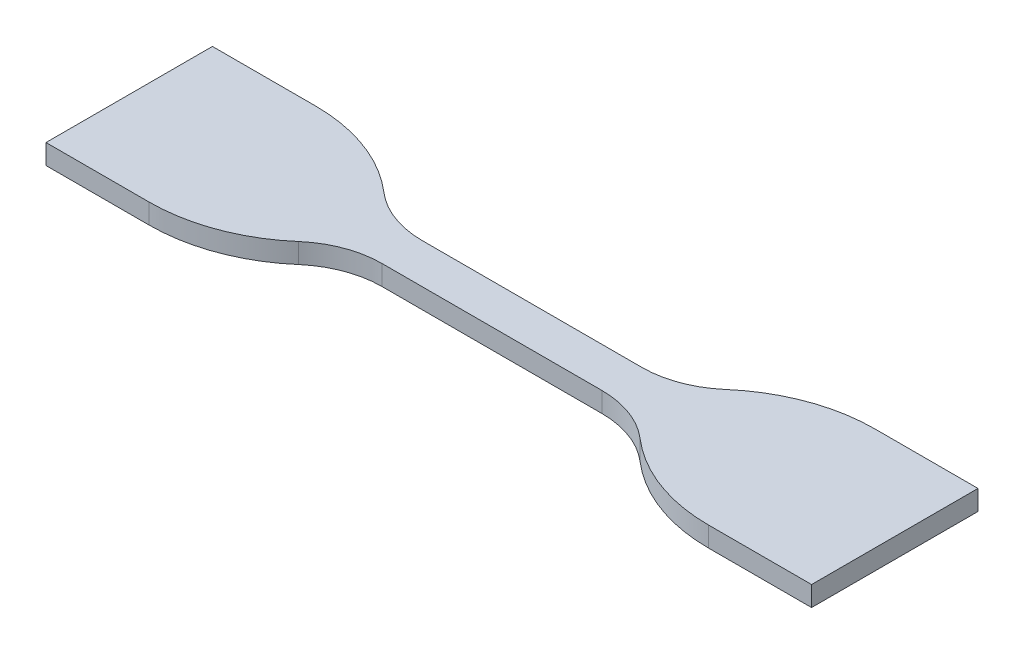
ISO-10303-21;
HEADER;
FILE_DESCRIPTION(('STEP AP214'),'2;1');
FILE_NAME('part.step','',(''),(''),'','','');
FILE_SCHEMA(('AUTOMOTIVE_DESIGN { 1 0 10303 214 1 1 1 1 }'));
ENDSEC;
DATA;
#1=APPLICATION_CONTEXT('core data for automotive mechanical design processes');
#2=APPLICATION_PROTOCOL_DEFINITION('international standard','automotive_design',2000,#1);
#3=PRODUCT_CONTEXT('',#1,'mechanical');
#4=PRODUCT('Part','Part','',(#3));
#5=PRODUCT_RELATED_PRODUCT_CATEGORY('part','',(#4));
#6=PRODUCT_DEFINITION_FORMATION('','',#4);
#7=PRODUCT_DEFINITION_CONTEXT('part definition',#1,'design');
#8=PRODUCT_DEFINITION('design','',#6,#7);
#9=PRODUCT_DEFINITION_SHAPE('','',#8);
#10=(LENGTH_UNIT() NAMED_UNIT(*) SI_UNIT(.MILLI.,.METRE.));
#11=(NAMED_UNIT(*) PLANE_ANGLE_UNIT() SI_UNIT($,.RADIAN.));
#12=(NAMED_UNIT(*) SI_UNIT($,.STERADIAN.) SOLID_ANGLE_UNIT());
#13=UNCERTAINTY_MEASURE_WITH_UNIT(LENGTH_MEASURE(1.E-05),#10,'distance_accuracy_value','');
#14=(GEOMETRIC_REPRESENTATION_CONTEXT(3) GLOBAL_UNCERTAINTY_ASSIGNED_CONTEXT((#13)) GLOBAL_UNIT_ASSIGNED_CONTEXT((#10,
#11,#12)) REPRESENTATION_CONTEXT('',''));
#15=CARTESIAN_POINT('',(0.,0.,0.));
#16=DIRECTION('',(0.,0.,1.));
#17=DIRECTION('',(1.,0.,0.));
#18=AXIS2_PLACEMENT_3D('',#15,#16,#17);
#19=CARTESIAN_POINT('',(25.5098020376482,3.,4.50000000000001));
#20=DIRECTION('',(0.,-1.,0.));
#21=DIRECTION('',(0.,0.,-1.));
#22=AXIS2_PLACEMENT_3D('',#19,#20,#21);
#23=CYLINDRICAL_SURFACE('',#22,14.);
#24=CARTESIAN_POINT('',(25.5098020376482,0.,4.50000000000001));
#25=DIRECTION('',(0.,-1.,0.));
#26=DIRECTION('',(0.,0.,-1.));
#27=AXIS2_PLACEMENT_3D('',#24,#25,#26);
#28=CIRCLE('',#27,14.);
#29=CARTESIAN_POINT('',(16.3524372036206,0.,-6.08974358974359));
#30=VERTEX_POINT('',#29);
#31=CARTESIAN_POINT('',(25.5098020376482,0.,-9.49999999999999));
#32=VERTEX_POINT('',#31);
#33=EDGE_CURVE('E179',#30,#32,#28,.T.);
#34=ORIENTED_EDGE('',*,*,#33,.T.);
#35=DIRECTION('',(0.,-1.,0.));
#36=VECTOR('',#35,1.);
#37=CARTESIAN_POINT('',(25.5098020376482,3.,-9.49999999999999));
#38=LINE('',#37,#36);
#39=CARTESIAN_POINT('',(25.5098020376482,3.,-9.49999999999999));
#40=VERTEX_POINT('',#39);
#41=EDGE_CURVE('E11',#40,#32,#38,.T.);
#42=ORIENTED_EDGE('',*,*,#41,.F.);
#43=CARTESIAN_POINT('',(25.5098020376482,3.,4.50000000000001));
#44=DIRECTION('',(0.,-1.,0.));
#45=DIRECTION('',(0.,0.,-1.));
#46=AXIS2_PLACEMENT_3D('',#43,#44,#45);
#47=CIRCLE('',#46,14.);
#48=CARTESIAN_POINT('',(16.3524372036206,3.,-6.08974358974359));
#49=VERTEX_POINT('',#48);
#50=EDGE_CURVE('E218',#49,#40,#47,.T.);
#51=ORIENTED_EDGE('',*,*,#50,.F.);
#52=DIRECTION('',(0.,-1.,0.));
#53=VECTOR('',#52,1.);
#54=CARTESIAN_POINT('',(16.3524372036206,3.,-6.08974358974359));
#55=LINE('',#54,#53);
#56=EDGE_CURVE('E175',#49,#30,#55,.T.);
#57=ORIENTED_EDGE('',*,*,#56,.T.);
#58=EDGE_LOOP('',(#34,#42,#51,#57));
#59=FACE_BOUND('',#58,.T.);
#60=ADVANCED_FACE('F36',(#59),#23,.F.);
#61=CARTESIAN_POINT('',(25.5098020376482,3.,-9.49999999999999));
#62=DIRECTION('',(0.,0.,-1.));
#63=DIRECTION('',(-1.,0.,0.));
#64=AXIS2_PLACEMENT_3D('',#61,#62,#63);
#65=PLANE('',#64);
#66=DIRECTION('',(1.,0.,0.));
#67=VECTOR('',#66,1.);
#68=CARTESIAN_POINT('',(25.5098020376482,0.,-9.49999999999999));
#69=LINE('',#68,#67);
#70=CARTESIAN_POINT('',(58.5098020376482,0.,-9.49999999999999));
#71=VERTEX_POINT('',#70);
#72=EDGE_CURVE('E182',#32,#71,#69,.T.);
#73=ORIENTED_EDGE('',*,*,#72,.T.);
#74=DIRECTION('',(0.,-1.,0.));
#75=VECTOR('',#74,1.);
#76=CARTESIAN_POINT('',(58.5098020376482,3.,-9.49999999999999));
#77=LINE('',#76,#75);
#78=CARTESIAN_POINT('',(58.5098020376482,3.,-9.49999999999999));
#79=VERTEX_POINT('',#78);
#80=EDGE_CURVE('E44',#79,#71,#77,.T.);
#81=ORIENTED_EDGE('',*,*,#80,.F.);
#82=DIRECTION('',(1.,0.,0.));
#83=VECTOR('',#82,1.);
#84=CARTESIAN_POINT('',(25.5098020376482,3.,-9.49999999999999));
#85=LINE('',#84,#83);
#86=EDGE_CURVE('E115',#40,#79,#85,.T.);
#87=ORIENTED_EDGE('',*,*,#86,.F.);
#88=ORIENTED_EDGE('',*,*,#41,.T.);
#89=EDGE_LOOP('',(#73,#81,#87,#88));
#90=FACE_BOUND('',#89,.T.);
#91=ADVANCED_FACE('F251',(#90),#65,.F.);
#92=CARTESIAN_POINT('',(58.5098020376482,3.,4.50000000000001));
#93=DIRECTION('',(0.,-1.,0.));
#94=DIRECTION('',(0.,0.,-1.));
#95=AXIS2_PLACEMENT_3D('',#92,#93,#94);
#96=CYLINDRICAL_SURFACE('',#95,14.);
#97=CARTESIAN_POINT('',(58.5098020376482,0.,4.50000000000001));
#98=DIRECTION('',(0.,1.,0.));
#99=DIRECTION('',(0.,0.,1.));
#100=AXIS2_PLACEMENT_3D('',#97,#98,#99);
#101=CIRCLE('',#100,14.);
#102=CARTESIAN_POINT('',(67.6671668716758,0.,-6.08974358974359));
#103=VERTEX_POINT('',#102);
#104=EDGE_CURVE('E185',#103,#71,#101,.T.);
#105=ORIENTED_EDGE('',*,*,#104,.F.);
#106=DIRECTION('',(0.,-1.,0.));
#107=VECTOR('',#106,1.);
#108=CARTESIAN_POINT('',(67.6671668716758,3.,-6.08974358974359));
#109=LINE('',#108,#107);
#110=CARTESIAN_POINT('',(67.6671668716758,3.,-6.08974358974359));
#111=VERTEX_POINT('',#110);
#112=EDGE_CURVE('E244',#111,#103,#109,.T.);
#113=ORIENTED_EDGE('',*,*,#112,.F.);
#114=CARTESIAN_POINT('',(58.5098020376482,3.,4.50000000000001));
#115=DIRECTION('',(0.,1.,0.));
#116=DIRECTION('',(0.,0.,1.));
#117=AXIS2_PLACEMENT_3D('',#114,#115,#116);
#118=CIRCLE('',#117,14.);
#119=EDGE_CURVE('E250',#111,#79,#118,.T.);
#120=ORIENTED_EDGE('',*,*,#119,.T.);
#121=ORIENTED_EDGE('',*,*,#80,.T.);
#122=EDGE_LOOP('',(#105,#113,#120,#121));
#123=FACE_BOUND('',#122,.T.);
#124=ADVANCED_FACE('F248',(#123),#96,.F.);
#125=CARTESIAN_POINT('',(84.0196040752964,3.,-25.));
#126=DIRECTION('',(0.,-1.,0.));
#127=DIRECTION('',(0.,0.,-1.));
#128=AXIS2_PLACEMENT_3D('',#125,#126,#127);
#129=CYLINDRICAL_SURFACE('',#128,25.);
#130=CARTESIAN_POINT('',(84.0196040752964,0.,-25.));
#131=DIRECTION('',(0.,-1.,0.));
#132=DIRECTION('',(0.,0.,-1.));
#133=AXIS2_PLACEMENT_3D('',#130,#131,#132);
#134=CIRCLE('',#133,25.);
#135=CARTESIAN_POINT('',(84.0196040752964,0.,0.));
#136=VERTEX_POINT('',#135);
#137=EDGE_CURVE('E188',#136,#103,#134,.T.);
#138=ORIENTED_EDGE('',*,*,#137,.F.);
#139=DIRECTION('',(0.,-1.,0.));
#140=VECTOR('',#139,1.);
#141=CARTESIAN_POINT('',(84.0196040752964,3.,0.));
#142=LINE('',#141,#140);
#143=CARTESIAN_POINT('',(84.0196040752964,3.,0.));
#144=VERTEX_POINT('',#143);
#145=EDGE_CURVE('E242',#144,#136,#142,.T.);
#146=ORIENTED_EDGE('',*,*,#145,.F.);
#147=CARTESIAN_POINT('',(84.0196040752964,3.,-25.));
#148=DIRECTION('',(0.,-1.,0.));
#149=DIRECTION('',(0.,0.,-1.));
#150=AXIS2_PLACEMENT_3D('',#147,#148,#149);
#151=CIRCLE('',#150,25.);
#152=EDGE_CURVE('E264',#144,#111,#151,.T.);
#153=ORIENTED_EDGE('',*,*,#152,.T.);
#154=ORIENTED_EDGE('',*,*,#112,.T.);
#155=EDGE_LOOP('',(#138,#146,#153,#154));
#156=FACE_BOUND('',#155,.T.);
#157=ADVANCED_FACE('F260',(#156),#129,.T.);
#158=CARTESIAN_POINT('',(84.0196040752964,3.,0.));
#159=DIRECTION('',(0.,0.,-1.));
#160=DIRECTION('',(-1.,0.,0.));
#161=AXIS2_PLACEMENT_3D('',#158,#159,#160);
#162=PLANE('',#161);
#163=DIRECTION('',(1.,0.,0.));
#164=VECTOR('',#163,1.);
#165=CARTESIAN_POINT('',(84.0196040752964,0.,0.));
#166=LINE('',#165,#164);
#167=CARTESIAN_POINT('',(99.5098020376482,0.,0.));
#168=VERTEX_POINT('',#167);
#169=EDGE_CURVE('E191',#136,#168,#166,.T.);
#170=ORIENTED_EDGE('',*,*,#169,.T.);
#171=DIRECTION('',(0.,-1.,0.));
#172=VECTOR('',#171,1.);
#173=CARTESIAN_POINT('',(99.5098020376482,3.,0.));
#174=LINE('',#173,#172);
#175=CARTESIAN_POINT('',(99.5098020376482,3.,0.));
#176=VERTEX_POINT('',#175);
#177=EDGE_CURVE('E239',#176,#168,#174,.T.);
#178=ORIENTED_EDGE('',*,*,#177,.F.);
#179=DIRECTION('',(1.,0.,0.));
#180=VECTOR('',#179,1.);
#181=CARTESIAN_POINT('',(84.0196040752964,3.,0.));
#182=LINE('',#181,#180);
#183=EDGE_CURVE('E266',#144,#176,#182,.T.);
#184=ORIENTED_EDGE('',*,*,#183,.F.);
#185=ORIENTED_EDGE('',*,*,#145,.T.);
#186=EDGE_LOOP('',(#170,#178,#184,#185));
#187=FACE_BOUND('',#186,.T.);
#188=ADVANCED_FACE('F315',(#187),#162,.F.);
#189=CARTESIAN_POINT('',(99.5098020376482,3.,0.));
#190=DIRECTION('',(-1.,0.,0.));
#191=DIRECTION('',(0.,0.,1.));
#192=AXIS2_PLACEMENT_3D('',#189,#190,#191);
#193=PLANE('',#192);
#194=DIRECTION('',(0.,0.,-1.));
#195=VECTOR('',#194,1.);
#196=CARTESIAN_POINT('',(99.5098020376482,0.,0.));
#197=LINE('',#196,#195);
#198=CARTESIAN_POINT('',(99.5098020376482,0.,-25.));
#199=VERTEX_POINT('',#198);
#200=EDGE_CURVE('E193',#168,#199,#197,.T.);
#201=ORIENTED_EDGE('',*,*,#200,.T.);
#202=DIRECTION('',(0.,-1.,0.));
#203=VECTOR('',#202,1.);
#204=CARTESIAN_POINT('',(99.5098020376482,3.,-25.));
#205=LINE('',#204,#203);
#206=CARTESIAN_POINT('',(99.5098020376482,3.,-25.));
#207=VERTEX_POINT('',#206);
#208=EDGE_CURVE('E236',#207,#199,#205,.T.);
#209=ORIENTED_EDGE('',*,*,#208,.F.);
#210=DIRECTION('',(0.,0.,-1.));
#211=VECTOR('',#210,1.);
#212=CARTESIAN_POINT('',(99.5098020376482,3.,0.));
#213=LINE('',#212,#211);
#214=EDGE_CURVE('E272',#176,#207,#213,.T.);
#215=ORIENTED_EDGE('',*,*,#214,.F.);
#216=ORIENTED_EDGE('',*,*,#177,.T.);
#217=EDGE_LOOP('',(#201,#209,#215,#216));
#218=FACE_BOUND('',#217,.T.);
#219=ADVANCED_FACE('F318',(#218),#193,.F.);
#220=CARTESIAN_POINT('',(99.5098020376482,3.,-25.));
#221=DIRECTION('',(0.,0.,1.));
#222=DIRECTION('',(1.,0.,0.));
#223=AXIS2_PLACEMENT_3D('',#220,#221,#222);
#224=PLANE('',#223);
#225=DIRECTION('',(-1.,0.,0.));
#226=VECTOR('',#225,1.);
#227=CARTESIAN_POINT('',(99.5098020376482,0.,-25.));
#228=LINE('',#227,#226);
#229=CARTESIAN_POINT('',(84.0196040752964,0.,-25.));
#230=VERTEX_POINT('',#229);
#231=EDGE_CURVE('E195',#199,#230,#228,.T.);
#232=ORIENTED_EDGE('',*,*,#231,.T.);
#233=DIRECTION('',(0.,-1.,0.));
#234=VECTOR('',#233,1.);
#235=CARTESIAN_POINT('',(84.0196040752964,3.,-25.));
#236=LINE('',#235,#234);
#237=CARTESIAN_POINT('',(84.0196040752964,3.,-25.));
#238=VERTEX_POINT('',#237);
#239=EDGE_CURVE('E233',#238,#230,#236,.T.);
#240=ORIENTED_EDGE('',*,*,#239,.F.);
#241=DIRECTION('',(-1.,0.,0.));
#242=VECTOR('',#241,1.);
#243=CARTESIAN_POINT('',(99.5098020376482,3.,-25.));
#244=LINE('',#243,#242);
#245=EDGE_CURVE('E274',#207,#238,#244,.T.);
#246=ORIENTED_EDGE('',*,*,#245,.F.);
#247=ORIENTED_EDGE('',*,*,#208,.T.);
#248=EDGE_LOOP('',(#232,#240,#246,#247));
#249=FACE_BOUND('',#248,.T.);
#250=ADVANCED_FACE('F322',(#249),#224,.F.);
#251=CARTESIAN_POINT('',(84.0196040752964,3.,0.));
#252=DIRECTION('',(0.,-1.,0.));
#253=DIRECTION('',(0.,0.,-1.));
#254=AXIS2_PLACEMENT_3D('',#251,#252,#253);
#255=CYLINDRICAL_SURFACE('',#254,25.);
#256=CARTESIAN_POINT('',(84.0196040752964,0.,0.));
#257=DIRECTION('',(0.,1.,0.));
#258=DIRECTION('',(0.,0.,1.));
#259=AXIS2_PLACEMENT_3D('',#256,#257,#258);
#260=CIRCLE('',#259,25.);
#261=CARTESIAN_POINT('',(67.6671668716758,0.,-18.9102564102564));
#262=VERTEX_POINT('',#261);
#263=EDGE_CURVE('E197',#230,#262,#260,.T.);
#264=ORIENTED_EDGE('',*,*,#263,.T.);
#265=DIRECTION('',(0.,-1.,0.));
#266=VECTOR('',#265,1.);
#267=CARTESIAN_POINT('',(67.6671668716758,3.,-18.9102564102564));
#268=LINE('',#267,#266);
#269=CARTESIAN_POINT('',(67.6671668716758,3.,-18.9102564102564));
#270=VERTEX_POINT('',#269);
#271=EDGE_CURVE('E230',#270,#262,#268,.T.);
#272=ORIENTED_EDGE('',*,*,#271,.F.);
#273=CARTESIAN_POINT('',(84.0196040752964,3.,0.));
#274=DIRECTION('',(0.,1.,0.));
#275=DIRECTION('',(0.,0.,1.));
#276=AXIS2_PLACEMENT_3D('',#273,#274,#275);
#277=CIRCLE('',#276,25.);
#278=EDGE_CURVE('E276',#238,#270,#277,.T.);
#279=ORIENTED_EDGE('',*,*,#278,.F.);
#280=ORIENTED_EDGE('',*,*,#239,.T.);
#281=EDGE_LOOP('',(#264,#272,#279,#280));
#282=FACE_BOUND('',#281,.T.);
#283=ADVANCED_FACE('F326',(#282),#255,.T.);
#284=CARTESIAN_POINT('',(58.5098020376482,3.,-29.5));
#285=DIRECTION('',(0.,-1.,0.));
#286=DIRECTION('',(0.,0.,-1.));
#287=AXIS2_PLACEMENT_3D('',#284,#285,#286);
#288=CYLINDRICAL_SURFACE('',#287,14.);
#289=CARTESIAN_POINT('',(58.5098020376482,0.,-29.5));
#290=DIRECTION('',(0.,-1.,0.));
#291=DIRECTION('',(0.,0.,-1.));
#292=AXIS2_PLACEMENT_3D('',#289,#290,#291);
#293=CIRCLE('',#292,14.);
#294=CARTESIAN_POINT('',(58.5098020376482,0.,-15.5));
#295=VERTEX_POINT('',#294);
#296=EDGE_CURVE('E199',#262,#295,#293,.T.);
#297=ORIENTED_EDGE('',*,*,#296,.T.);
#298=DIRECTION('',(0.,-1.,0.));
#299=VECTOR('',#298,1.);
#300=CARTESIAN_POINT('',(58.5098020376482,3.,-15.5));
#301=LINE('',#300,#299);
#302=CARTESIAN_POINT('',(58.5098020376482,3.,-15.5));
#303=VERTEX_POINT('',#302);
#304=EDGE_CURVE('E228',#303,#295,#301,.T.);
#305=ORIENTED_EDGE('',*,*,#304,.F.);
#306=CARTESIAN_POINT('',(58.5098020376482,3.,-29.5));
#307=DIRECTION('',(0.,-1.,0.));
#308=DIRECTION('',(0.,0.,-1.));
#309=AXIS2_PLACEMENT_3D('',#306,#307,#308);
#310=CIRCLE('',#309,14.);
#311=EDGE_CURVE('E278',#270,#303,#310,.T.);
#312=ORIENTED_EDGE('',*,*,#311,.F.);
#313=ORIENTED_EDGE('',*,*,#271,.T.);
#314=EDGE_LOOP('',(#297,#305,#312,#313));
#315=FACE_BOUND('',#314,.T.);
#316=ADVANCED_FACE('F330',(#315),#288,.F.);
#317=CARTESIAN_POINT('',(25.5098020376482,3.,-15.5));
#318=DIRECTION('',(0.,0.,-1.));
#319=DIRECTION('',(-1.,0.,0.));
#320=AXIS2_PLACEMENT_3D('',#317,#318,#319);
#321=PLANE('',#320);
#322=DIRECTION('',(1.,0.,0.));
#323=VECTOR('',#322,1.);
#324=CARTESIAN_POINT('',(25.5098020376482,0.,-15.5));
#325=LINE('',#324,#323);
#326=CARTESIAN_POINT('',(25.5098020376482,0.,-15.5));
#327=VERTEX_POINT('',#326);
#328=EDGE_CURVE('E202',#327,#295,#325,.T.);
#329=ORIENTED_EDGE('',*,*,#328,.F.);
#330=DIRECTION('',(0.,-1.,0.));
#331=VECTOR('',#330,1.);
#332=CARTESIAN_POINT('',(25.5098020376482,3.,-15.5));
#333=LINE('',#332,#331);
#334=CARTESIAN_POINT('',(25.5098020376482,3.,-15.5));
#335=VERTEX_POINT('',#334);
#336=EDGE_CURVE('E226',#335,#327,#333,.T.);
#337=ORIENTED_EDGE('',*,*,#336,.F.);
#338=DIRECTION('',(1.,0.,0.));
#339=VECTOR('',#338,1.);
#340=CARTESIAN_POINT('',(25.5098020376482,3.,-15.5));
#341=LINE('',#340,#339);
#342=EDGE_CURVE('E280',#335,#303,#341,.T.);
#343=ORIENTED_EDGE('',*,*,#342,.T.);
#344=ORIENTED_EDGE('',*,*,#304,.T.);
#345=EDGE_LOOP('',(#329,#337,#343,#344));
#346=FACE_BOUND('',#345,.T.);
#347=ADVANCED_FACE('F334',(#346),#321,.T.);
#348=CARTESIAN_POINT('',(25.5098020376482,3.,-29.5));
#349=DIRECTION('',(0.,-1.,0.));
#350=DIRECTION('',(0.,0.,-1.));
#351=AXIS2_PLACEMENT_3D('',#348,#349,#350);
#352=CYLINDRICAL_SURFACE('',#351,14.);
#353=CARTESIAN_POINT('',(25.5098020376482,0.,-29.5));
#354=DIRECTION('',(0.,1.,0.));
#355=DIRECTION('',(0.,0.,1.));
#356=AXIS2_PLACEMENT_3D('',#353,#354,#355);
#357=CIRCLE('',#356,14.);
#358=CARTESIAN_POINT('',(16.3524372036206,0.,-18.9102564102564));
#359=VERTEX_POINT('',#358);
#360=EDGE_CURVE('E205',#359,#327,#357,.T.);
#361=ORIENTED_EDGE('',*,*,#360,.F.);
#362=DIRECTION('',(0.,-1.,0.));
#363=VECTOR('',#362,1.);
#364=CARTESIAN_POINT('',(16.3524372036206,3.,-18.9102564102564));
#365=LINE('',#364,#363);
#366=CARTESIAN_POINT('',(16.3524372036206,3.,-18.9102564102564));
#367=VERTEX_POINT('',#366);
#368=EDGE_CURVE('E224',#367,#359,#365,.T.);
#369=ORIENTED_EDGE('',*,*,#368,.F.);
#370=CARTESIAN_POINT('',(25.5098020376482,3.,-29.5));
#371=DIRECTION('',(0.,1.,0.));
#372=DIRECTION('',(0.,0.,1.));
#373=AXIS2_PLACEMENT_3D('',#370,#371,#372);
#374=CIRCLE('',#373,14.);
#375=EDGE_CURVE('E283',#367,#335,#374,.T.);
#376=ORIENTED_EDGE('',*,*,#375,.T.);
#377=ORIENTED_EDGE('',*,*,#336,.T.);
#378=EDGE_LOOP('',(#361,#369,#376,#377));
#379=FACE_BOUND('',#378,.T.);
#380=ADVANCED_FACE('F338',(#379),#352,.F.);
#381=CARTESIAN_POINT('',(0.,3.,0.));
#382=DIRECTION('',(0.,-1.,0.));
#383=DIRECTION('',(0.,0.,-1.));
#384=AXIS2_PLACEMENT_3D('',#381,#382,#383);
#385=CYLINDRICAL_SURFACE('',#384,25.);
#386=CARTESIAN_POINT('',(0.,0.,0.));
#387=DIRECTION('',(0.,-1.,0.));
#388=DIRECTION('',(0.,0.,-1.));
#389=AXIS2_PLACEMENT_3D('',#386,#387,#388);
#390=CIRCLE('',#389,25.);
#391=CARTESIAN_POINT('',(0.,0.,-25.));
#392=VERTEX_POINT('',#391);
#393=EDGE_CURVE('E208',#392,#359,#390,.T.);
#394=ORIENTED_EDGE('',*,*,#393,.F.);
#395=DIRECTION('',(0.,-1.,0.));
#396=VECTOR('',#395,1.);
#397=CARTESIAN_POINT('',(0.,3.,-25.));
#398=LINE('',#397,#396);
#399=CARTESIAN_POINT('',(0.,3.,-25.));
#400=VERTEX_POINT('',#399);
#401=EDGE_CURVE('E222',#400,#392,#398,.T.);
#402=ORIENTED_EDGE('',*,*,#401,.F.);
#403=CARTESIAN_POINT('',(0.,3.,0.));
#404=DIRECTION('',(0.,-1.,0.));
#405=DIRECTION('',(0.,0.,-1.));
#406=AXIS2_PLACEMENT_3D('',#403,#404,#405);
#407=CIRCLE('',#406,25.);
#408=EDGE_CURVE('E286',#400,#367,#407,.T.);
#409=ORIENTED_EDGE('',*,*,#408,.T.);
#410=ORIENTED_EDGE('',*,*,#368,.T.);
#411=EDGE_LOOP('',(#394,#402,#409,#410));
#412=FACE_BOUND('',#411,.T.);
#413=ADVANCED_FACE('F342',(#412),#385,.T.);
#414=CARTESIAN_POINT('',(-15.4901979623518,3.,-25.));
#415=DIRECTION('',(0.,0.,-1.));
#416=DIRECTION('',(-1.,0.,0.));
#417=AXIS2_PLACEMENT_3D('',#414,#415,#416);
#418=PLANE('',#417);
#419=DIRECTION('',(1.,0.,0.));
#420=VECTOR('',#419,1.);
#421=CARTESIAN_POINT('',(-15.4901979623518,0.,-25.));
#422=LINE('',#421,#420);
#423=CARTESIAN_POINT('',(-15.4901979623518,0.,-25.));
#424=VERTEX_POINT('',#423);
#425=EDGE_CURVE('E211',#424,#392,#422,.T.);
#426=ORIENTED_EDGE('',*,*,#425,.F.);
#427=DIRECTION('',(0.,-1.,0.));
#428=VECTOR('',#427,1.);
#429=CARTESIAN_POINT('',(-15.4901979623518,3.,-25.));
#430=LINE('',#429,#428);
#431=CARTESIAN_POINT('',(-15.4901979623518,3.,-25.));
#432=VERTEX_POINT('',#431);
#433=EDGE_CURVE('E164',#432,#424,#430,.T.);
#434=ORIENTED_EDGE('',*,*,#433,.F.);
#435=DIRECTION('',(1.,0.,0.));
#436=VECTOR('',#435,1.);
#437=CARTESIAN_POINT('',(-15.4901979623518,3.,-25.));
#438=LINE('',#437,#436);
#439=EDGE_CURVE('E171',#432,#400,#438,.T.);
#440=ORIENTED_EDGE('',*,*,#439,.T.);
#441=ORIENTED_EDGE('',*,*,#401,.T.);
#442=EDGE_LOOP('',(#426,#434,#440,#441));
#443=FACE_BOUND('',#442,.T.);
#444=ADVANCED_FACE('F290',(#443),#418,.T.);
#445=CARTESIAN_POINT('',(-15.4901979623518,3.,0.));
#446=DIRECTION('',(-1.,0.,0.));
#447=DIRECTION('',(0.,0.,1.));
#448=AXIS2_PLACEMENT_3D('',#445,#446,#447);
#449=PLANE('',#448);
#450=DIRECTION('',(0.,0.,-1.));
#451=VECTOR('',#450,1.);
#452=CARTESIAN_POINT('',(-15.4901979623518,0.,0.));
#453=LINE('',#452,#451);
#454=CARTESIAN_POINT('',(-15.4901979623518,0.,0.));
#455=VERTEX_POINT('',#454);
#456=EDGE_CURVE('E159',#455,#424,#453,.T.);
#457=ORIENTED_EDGE('',*,*,#456,.F.);
#458=DIRECTION('',(0.,-1.,0.));
#459=VECTOR('',#458,1.);
#460=CARTESIAN_POINT('',(-15.4901979623518,3.,0.));
#461=LINE('',#460,#459);
#462=CARTESIAN_POINT('',(-15.4901979623518,3.,0.));
#463=VERTEX_POINT('',#462);
#464=EDGE_CURVE('E154',#463,#455,#461,.T.);
#465=ORIENTED_EDGE('',*,*,#464,.F.);
#466=DIRECTION('',(0.,0.,-1.));
#467=VECTOR('',#466,1.);
#468=CARTESIAN_POINT('',(-15.4901979623518,3.,0.));
#469=LINE('',#468,#467);
#470=EDGE_CURVE('E157',#463,#432,#469,.T.);
#471=ORIENTED_EDGE('',*,*,#470,.T.);
#472=ORIENTED_EDGE('',*,*,#433,.T.);
#473=EDGE_LOOP('',(#457,#465,#471,#472));
#474=FACE_BOUND('',#473,.T.);
#475=ADVANCED_FACE('F156',(#474),#449,.T.);
#476=CARTESIAN_POINT('',(0.,3.,0.));
#477=DIRECTION('',(0.,0.,1.));
#478=DIRECTION('',(1.,0.,0.));
#479=AXIS2_PLACEMENT_3D('',#476,#477,#478);
#480=PLANE('',#479);
#481=DIRECTION('',(-1.,0.,0.));
#482=VECTOR('',#481,1.);
#483=CARTESIAN_POINT('',(0.,0.,0.));
#484=LINE('',#483,#482);
#485=CARTESIAN_POINT('',(0.,0.,0.));
#486=VERTEX_POINT('',#485);
#487=EDGE_CURVE('E215',#486,#455,#484,.T.);
#488=ORIENTED_EDGE('',*,*,#487,.F.);
#489=DIRECTION('',(0.,-1.,0.));
#490=VECTOR('',#489,1.);
#491=CARTESIAN_POINT('',(0.,3.,0.));
#492=LINE('',#491,#490);
#493=CARTESIAN_POINT('',(0.,3.,0.));
#494=VERTEX_POINT('',#493);
#495=EDGE_CURVE('E104',#494,#486,#492,.T.);
#496=ORIENTED_EDGE('',*,*,#495,.F.);
#497=DIRECTION('',(-1.,0.,0.));
#498=VECTOR('',#497,1.);
#499=CARTESIAN_POINT('',(0.,3.,0.));
#500=LINE('',#499,#498);
#501=EDGE_CURVE('E168',#494,#463,#500,.T.);
#502=ORIENTED_EDGE('',*,*,#501,.T.);
#503=ORIENTED_EDGE('',*,*,#464,.T.);
#504=EDGE_LOOP('',(#488,#496,#502,#503));
#505=FACE_BOUND('',#504,.T.);
#506=ADVANCED_FACE('F173',(#505),#480,.T.);
#507=CARTESIAN_POINT('',(0.,3.,-25.));
#508=DIRECTION('',(0.,-1.,0.));
#509=DIRECTION('',(0.,0.,-1.));
#510=AXIS2_PLACEMENT_3D('',#507,#508,#509);
#511=CYLINDRICAL_SURFACE('',#510,25.);
#512=CARTESIAN_POINT('',(0.,0.,-25.));
#513=DIRECTION('',(0.,1.,0.));
#514=DIRECTION('',(0.,0.,1.));
#515=AXIS2_PLACEMENT_3D('',#512,#513,#514);
#516=CIRCLE('',#515,25.);
#517=EDGE_CURVE('E107',#486,#30,#516,.T.);
#518=ORIENTED_EDGE('',*,*,#517,.T.);
#519=ORIENTED_EDGE('',*,*,#56,.F.);
#520=CARTESIAN_POINT('',(0.,3.,-25.));
#521=DIRECTION('',(0.,1.,0.));
#522=DIRECTION('',(0.,0.,1.));
#523=AXIS2_PLACEMENT_3D('',#520,#521,#522);
#524=CIRCLE('',#523,25.);
#525=EDGE_CURVE('E52',#494,#49,#524,.T.);
#526=ORIENTED_EDGE('',*,*,#525,.F.);
#527=ORIENTED_EDGE('',*,*,#495,.T.);
#528=EDGE_LOOP('',(#518,#519,#526,#527));
#529=FACE_BOUND('',#528,.T.);
#530=ADVANCED_FACE('F294',(#529),#511,.T.);
#531=CARTESIAN_POINT('',(25.5098020376482,3.,4.50000000000001));
#532=DIRECTION('',(0.,-1.,0.));
#533=DIRECTION('',(0.,0.,-1.));
#534=AXIS2_PLACEMENT_3D('',#531,#532,#533);
#535=PLANE('',#534);
#536=ORIENTED_EDGE('',*,*,#50,.T.);
#537=ORIENTED_EDGE('',*,*,#86,.T.);
#538=ORIENTED_EDGE('',*,*,#119,.F.);
#539=ORIENTED_EDGE('',*,*,#152,.F.);
#540=ORIENTED_EDGE('',*,*,#183,.T.);
#541=ORIENTED_EDGE('',*,*,#214,.T.);
#542=ORIENTED_EDGE('',*,*,#245,.T.);
#543=ORIENTED_EDGE('',*,*,#278,.T.);
#544=ORIENTED_EDGE('',*,*,#311,.T.);
#545=ORIENTED_EDGE('',*,*,#342,.F.);
#546=ORIENTED_EDGE('',*,*,#375,.F.);
#547=ORIENTED_EDGE('',*,*,#408,.F.);
#548=ORIENTED_EDGE('',*,*,#439,.F.);
#549=ORIENTED_EDGE('',*,*,#470,.F.);
#550=ORIENTED_EDGE('',*,*,#501,.F.);
#551=ORIENTED_EDGE('',*,*,#525,.T.);
#552=EDGE_LOOP('',(#536,#537,#538,#539,#540,#541,#542,#543,#544,#545,#546,#547,#548,#549,#550,#551));
#553=FACE_BOUND('',#552,.T.);
#554=ADVANCED_FACE('F167',(#553),#535,.F.);
#555=CARTESIAN_POINT('',(25.5098020376482,0.,4.50000000000001));
#556=DIRECTION('',(0.,-1.,0.));
#557=DIRECTION('',(0.,0.,-1.));
#558=AXIS2_PLACEMENT_3D('',#555,#556,#557);
#559=PLANE('',#558);
#560=ORIENTED_EDGE('',*,*,#33,.F.);
#561=ORIENTED_EDGE('',*,*,#517,.F.);
#562=ORIENTED_EDGE('',*,*,#487,.T.);
#563=ORIENTED_EDGE('',*,*,#456,.T.);
#564=ORIENTED_EDGE('',*,*,#425,.T.);
#565=ORIENTED_EDGE('',*,*,#393,.T.);
#566=ORIENTED_EDGE('',*,*,#360,.T.);
#567=ORIENTED_EDGE('',*,*,#328,.T.);
#568=ORIENTED_EDGE('',*,*,#296,.F.);
#569=ORIENTED_EDGE('',*,*,#263,.F.);
#570=ORIENTED_EDGE('',*,*,#231,.F.);
#571=ORIENTED_EDGE('',*,*,#200,.F.);
#572=ORIENTED_EDGE('',*,*,#169,.F.);
#573=ORIENTED_EDGE('',*,*,#137,.T.);
#574=ORIENTED_EDGE('',*,*,#104,.T.);
#575=ORIENTED_EDGE('',*,*,#72,.F.);
#576=EDGE_LOOP('',(#560,#561,#562,#563,#564,#565,#566,#567,#568,#569,#570,#571,#572,#573,#574,#575));
#577=FACE_BOUND('',#576,.T.);
#578=ADVANCED_FACE('F255',(#577),#559,.T.);
#579=CLOSED_SHELL('',(#60,#91,#124,#157,#188,#219,#250,#283,#316,#347,#380,#413,#444,#475,#506,
#530,#554,#578));
#580=MANIFOLD_SOLID_BREP('B2',#579);
#581=ADVANCED_BREP_SHAPE_REPRESENTATION('',(#18,#580),#14);
#582=SHAPE_DEFINITION_REPRESENTATION(#9,#581);
ENDSEC;
END-ISO-10303-21;
